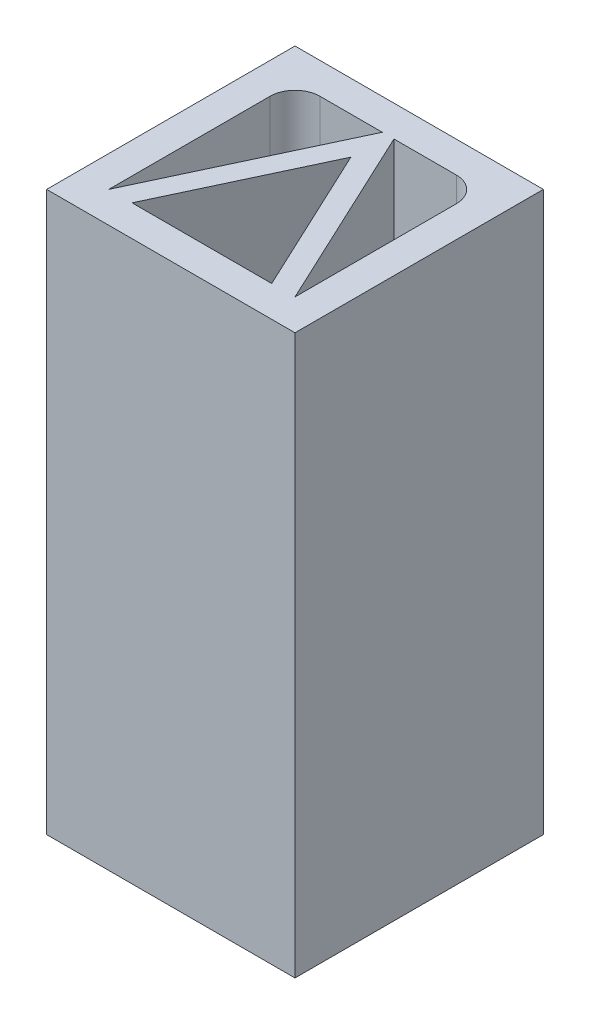
ISO-10303-21;
HEADER;
FILE_DESCRIPTION(('STEP AP214'),'2;1');
FILE_NAME('part.step','',(''),(''),'','','');
FILE_SCHEMA(('AUTOMOTIVE_DESIGN { 1 0 10303 214 1 1 1 1 }'));
ENDSEC;
DATA;
#1=APPLICATION_CONTEXT('core data for automotive mechanical design processes');
#2=APPLICATION_PROTOCOL_DEFINITION('international standard','automotive_design',2000,#1);
#3=PRODUCT_CONTEXT('',#1,'mechanical');
#4=PRODUCT('Part','Part','',(#3));
#5=PRODUCT_RELATED_PRODUCT_CATEGORY('part','',(#4));
#6=PRODUCT_DEFINITION_FORMATION('','',#4);
#7=PRODUCT_DEFINITION_CONTEXT('part definition',#1,'design');
#8=PRODUCT_DEFINITION('design','',#6,#7);
#9=PRODUCT_DEFINITION_SHAPE('','',#8);
#10=(LENGTH_UNIT() NAMED_UNIT(*) SI_UNIT(.MILLI.,.METRE.));
#11=(NAMED_UNIT(*) PLANE_ANGLE_UNIT() SI_UNIT($,.RADIAN.));
#12=(NAMED_UNIT(*) SI_UNIT($,.STERADIAN.) SOLID_ANGLE_UNIT());
#13=UNCERTAINTY_MEASURE_WITH_UNIT(LENGTH_MEASURE(1.E-05),#10,'distance_accuracy_value','');
#14=(GEOMETRIC_REPRESENTATION_CONTEXT(3) GLOBAL_UNCERTAINTY_ASSIGNED_CONTEXT((#13)) GLOBAL_UNIT_ASSIGNED_CONTEXT((#10,
#11,#12)) REPRESENTATION_CONTEXT('',''));
#15=CARTESIAN_POINT('',(0.,0.,0.));
#16=DIRECTION('',(0.,0.,1.));
#17=DIRECTION('',(1.,0.,0.));
#18=AXIS2_PLACEMENT_3D('',#15,#16,#17);
#19=CARTESIAN_POINT('',(2.5,45.,-17.5));
#20=DIRECTION('',(0.,0.,1.));
#21=DIRECTION('',(1.,0.,0.));
#22=AXIS2_PLACEMENT_3D('',#19,#20,#21);
#23=PLANE('',#22);
#24=DIRECTION('',(-1.,0.,0.));
#25=VECTOR('',#24,1.);
#26=CARTESIAN_POINT('',(2.5,0.,-17.5));
#27=LINE('',#26,#25);
#28=CARTESIAN_POINT('',(15.5,0.,-17.5));
#29=VERTEX_POINT('',#28);
#30=CARTESIAN_POINT('',(10.46875,0.,-17.5));
#31=VERTEX_POINT('',#30);
#32=EDGE_CURVE('E200',#29,#31,#27,.T.);
#33=ORIENTED_EDGE('',*,*,#32,.F.);
#34=DIRECTION('',(0.,-1.,0.));
#35=VECTOR('',#34,1.);
#36=CARTESIAN_POINT('',(15.5,45.,-17.5));
#37=LINE('',#36,#35);
#38=CARTESIAN_POINT('',(15.5,45.,-17.5));
#39=VERTEX_POINT('',#38);
#40=EDGE_CURVE('E55',#29,#39,#37,.F.);
#41=ORIENTED_EDGE('',*,*,#40,.T.);
#42=DIRECTION('',(-1.,0.,0.));
#43=VECTOR('',#42,1.);
#44=CARTESIAN_POINT('',(2.5,45.,-17.5));
#45=LINE('',#44,#43);
#46=CARTESIAN_POINT('',(10.46875,45.,-17.5));
#47=VERTEX_POINT('',#46);
#48=EDGE_CURVE('E208',#39,#47,#45,.T.);
#49=ORIENTED_EDGE('',*,*,#48,.T.);
#50=DIRECTION('',(0.,1.,0.));
#51=VECTOR('',#50,1.);
#52=CARTESIAN_POINT('',(10.46875,45.,-17.5));
#53=LINE('',#52,#51);
#54=EDGE_CURVE('E277',#31,#47,#53,.T.);
#55=ORIENTED_EDGE('',*,*,#54,.F.);
#56=EDGE_LOOP('',(#33,#41,#49,#55));
#57=FACE_BOUND('',#56,.T.);
#58=ADVANCED_FACE('F39',(#57),#23,.T.);
#59=CARTESIAN_POINT('',(0.,45.,0.));
#60=DIRECTION('',(0.,-1.,0.));
#61=DIRECTION('',(0.,0.,-1.));
#62=AXIS2_PLACEMENT_3D('',#59,#60,#61);
#63=PLANE('',#62);
#64=DIRECTION('',(0.424433876230719,0.,0.905458935958869));
#65=VECTOR('',#64,1.);
#66=CARTESIAN_POINT('',(17.5,45.,-2.5));
#67=LINE('',#66,#65);
#68=CARTESIAN_POINT('',(17.5,45.,-2.5));
#69=VERTEX_POINT('',#68);
#70=EDGE_CURVE('E181',#47,#69,#67,.T.);
#71=ORIENTED_EDGE('',*,*,#70,.F.);
#72=ORIENTED_EDGE('',*,*,#48,.F.);
#73=CARTESIAN_POINT('',(15.5,45.,-15.5));
#74=DIRECTION('',(0.,-1.,0.));
#75=DIRECTION('',(0.,0.,-1.));
#76=AXIS2_PLACEMENT_3D('',#73,#74,#75);
#77=CIRCLE('',#76,2.);
#78=CARTESIAN_POINT('',(17.5,45.,-15.5));
#79=VERTEX_POINT('',#78);
#80=EDGE_CURVE('E11',#39,#79,#77,.T.);
#81=ORIENTED_EDGE('',*,*,#80,.T.);
#82=DIRECTION('',(0.,0.,-1.));
#83=VECTOR('',#82,1.);
#84=CARTESIAN_POINT('',(17.5,45.,-17.5));
#85=LINE('',#84,#83);
#86=EDGE_CURVE('E203',#69,#79,#85,.T.);
#87=ORIENTED_EDGE('',*,*,#86,.F.);
#88=EDGE_LOOP('',(#71,#72,#81,#87));
#89=FACE_BOUND('',#88,.T.);
#90=DIRECTION('',(-0.424433876230719,0.,-0.905458935958869));
#91=VECTOR('',#90,1.);
#92=CARTESIAN_POINT('',(15.625,45.,-2.5));
#93=LINE('',#92,#91);
#94=CARTESIAN_POINT('',(15.625,45.,-2.5));
#95=VERTEX_POINT('',#94);
#96=CARTESIAN_POINT('',(10.,45.,-14.5));
#97=VERTEX_POINT('',#96);
#98=EDGE_CURVE('E164',#95,#97,#93,.T.);
#99=ORIENTED_EDGE('',*,*,#98,.F.);
#100=DIRECTION('',(1.,0.,0.));
#101=VECTOR('',#100,1.);
#102=CARTESIAN_POINT('',(2.5,45.,-2.5));
#103=LINE('',#102,#101);
#104=CARTESIAN_POINT('',(4.375,45.,-2.5));
#105=VERTEX_POINT('',#104);
#106=EDGE_CURVE('E165',#105,#95,#103,.T.);
#107=ORIENTED_EDGE('',*,*,#106,.F.);
#108=DIRECTION('',(-0.424433876230719,0.,0.905458935958869));
#109=VECTOR('',#108,1.);
#110=CARTESIAN_POINT('',(10.,45.,-14.5));
#111=LINE('',#110,#109);
#112=EDGE_CURVE('E148',#97,#105,#111,.T.);
#113=ORIENTED_EDGE('',*,*,#112,.F.);
#114=EDGE_LOOP('',(#99,#107,#113));
#115=FACE_BOUND('',#114,.T.);
#116=DIRECTION('',(0.,0.,1.));
#117=VECTOR('',#116,1.);
#118=CARTESIAN_POINT('',(0.,45.,0.));
#119=LINE('',#118,#117);
#120=CARTESIAN_POINT('',(0.,45.,-20.));
#121=VERTEX_POINT('',#120);
#122=CARTESIAN_POINT('',(0.,45.,0.));
#123=VERTEX_POINT('',#122);
#124=EDGE_CURVE('E232',#121,#123,#119,.T.);
#125=ORIENTED_EDGE('',*,*,#124,.T.);
#126=DIRECTION('',(1.,0.,0.));
#127=VECTOR('',#126,1.);
#128=CARTESIAN_POINT('',(0.,45.,0.));
#129=LINE('',#128,#127);
#130=CARTESIAN_POINT('',(20.,45.,0.));
#131=VERTEX_POINT('',#130);
#132=EDGE_CURVE('E236',#123,#131,#129,.T.);
#133=ORIENTED_EDGE('',*,*,#132,.T.);
#134=DIRECTION('',(0.,0.,-1.));
#135=VECTOR('',#134,1.);
#136=CARTESIAN_POINT('',(20.,45.,0.));
#137=LINE('',#136,#135);
#138=CARTESIAN_POINT('',(20.,45.,-20.));
#139=VERTEX_POINT('',#138);
#140=EDGE_CURVE('E240',#131,#139,#137,.T.);
#141=ORIENTED_EDGE('',*,*,#140,.T.);
#142=DIRECTION('',(-1.,0.,0.));
#143=VECTOR('',#142,1.);
#144=CARTESIAN_POINT('',(0.,45.,-20.));
#145=LINE('',#144,#143);
#146=EDGE_CURVE('E243',#139,#121,#145,.T.);
#147=ORIENTED_EDGE('',*,*,#146,.T.);
#148=EDGE_LOOP('',(#125,#133,#141,#147));
#149=FACE_BOUND('',#148,.T.);
#150=CARTESIAN_POINT('',(9.53125,45.,-17.5));
#151=VERTEX_POINT('',#150);
#152=CARTESIAN_POINT('',(4.5,45.,-17.5));
#153=VERTEX_POINT('',#152);
#154=EDGE_CURVE('E207',#151,#153,#45,.T.);
#155=ORIENTED_EDGE('',*,*,#154,.F.);
#156=DIRECTION('',(0.424433876230719,0.,-0.905458935958869));
#157=VECTOR('',#156,1.);
#158=CARTESIAN_POINT('',(10.,45.,-18.5));
#159=LINE('',#158,#157);
#160=CARTESIAN_POINT('',(2.5,45.,-2.5));
#161=VERTEX_POINT('',#160);
#162=EDGE_CURVE('E167',#161,#151,#159,.T.);
#163=ORIENTED_EDGE('',*,*,#162,.F.);
#164=DIRECTION('',(0.,0.,1.));
#165=VECTOR('',#164,1.);
#166=CARTESIAN_POINT('',(2.5,45.,-17.5));
#167=LINE('',#166,#165);
#168=CARTESIAN_POINT('',(2.5,45.,-15.5));
#169=VERTEX_POINT('',#168);
#170=EDGE_CURVE('E197',#169,#161,#167,.T.);
#171=ORIENTED_EDGE('',*,*,#170,.F.);
#172=CARTESIAN_POINT('',(4.5,45.,-15.5));
#173=DIRECTION('',(0.,-1.,0.));
#174=DIRECTION('',(0.,0.,-1.));
#175=AXIS2_PLACEMENT_3D('',#172,#173,#174);
#176=CIRCLE('',#175,2.);
#177=EDGE_CURVE('E297',#169,#153,#176,.T.);
#178=ORIENTED_EDGE('',*,*,#177,.T.);
#179=EDGE_LOOP('',(#155,#163,#171,#178));
#180=FACE_BOUND('',#179,.T.);
#181=ADVANCED_FACE('F162',(#89,#115,#149,#180),#63,.F.);
#182=CARTESIAN_POINT('',(0.,0.,0.));
#183=DIRECTION('',(0.,-1.,0.));
#184=DIRECTION('',(0.,0.,-1.));
#185=AXIS2_PLACEMENT_3D('',#182,#183,#184);
#186=PLANE('',#185);
#187=DIRECTION('',(0.,0.,-1.));
#188=VECTOR('',#187,1.);
#189=CARTESIAN_POINT('',(17.5,0.,-17.5));
#190=LINE('',#189,#188);
#191=CARTESIAN_POINT('',(17.5,0.,-2.5));
#192=VERTEX_POINT('',#191);
#193=CARTESIAN_POINT('',(17.5,0.,-15.5));
#194=VERTEX_POINT('',#193);
#195=EDGE_CURVE('E218',#192,#194,#190,.T.);
#196=ORIENTED_EDGE('',*,*,#195,.T.);
#197=CARTESIAN_POINT('',(15.5,0.,-15.5));
#198=DIRECTION('',(0.,-1.,0.));
#199=DIRECTION('',(0.,0.,-1.));
#200=AXIS2_PLACEMENT_3D('',#197,#198,#199);
#201=CIRCLE('',#200,2.);
#202=EDGE_CURVE('E48',#194,#29,#201,.F.);
#203=ORIENTED_EDGE('',*,*,#202,.T.);
#204=ORIENTED_EDGE('',*,*,#32,.T.);
#205=DIRECTION('',(0.424433876230719,0.,0.905458935958869));
#206=VECTOR('',#205,1.);
#207=CARTESIAN_POINT('',(17.5,0.,-2.5));
#208=LINE('',#207,#206);
#209=EDGE_CURVE('E172',#31,#192,#208,.T.);
#210=ORIENTED_EDGE('',*,*,#209,.T.);
#211=EDGE_LOOP('',(#196,#203,#204,#210));
#212=FACE_BOUND('',#211,.T.);
#213=DIRECTION('',(1.,0.,0.));
#214=VECTOR('',#213,1.);
#215=CARTESIAN_POINT('',(2.5,0.,-2.5));
#216=LINE('',#215,#214);
#217=CARTESIAN_POINT('',(4.375,0.,-2.5));
#218=VERTEX_POINT('',#217);
#219=CARTESIAN_POINT('',(15.625,0.,-2.5));
#220=VERTEX_POINT('',#219);
#221=EDGE_CURVE('E214',#218,#220,#216,.T.);
#222=ORIENTED_EDGE('',*,*,#221,.T.);
#223=DIRECTION('',(-0.424433876230719,0.,-0.905458935958869));
#224=VECTOR('',#223,1.);
#225=CARTESIAN_POINT('',(15.625,0.,-2.5));
#226=LINE('',#225,#224);
#227=CARTESIAN_POINT('',(10.,0.,-14.5));
#228=VERTEX_POINT('',#227);
#229=EDGE_CURVE('E185',#220,#228,#226,.T.);
#230=ORIENTED_EDGE('',*,*,#229,.T.);
#231=DIRECTION('',(-0.424433876230719,0.,0.905458935958869));
#232=VECTOR('',#231,1.);
#233=CARTESIAN_POINT('',(10.,0.,-14.5));
#234=LINE('',#233,#232);
#235=EDGE_CURVE('E150',#228,#218,#234,.T.);
#236=ORIENTED_EDGE('',*,*,#235,.T.);
#237=EDGE_LOOP('',(#222,#230,#236));
#238=FACE_BOUND('',#237,.T.);
#239=DIRECTION('',(0.424433876230719,0.,-0.905458935958869));
#240=VECTOR('',#239,1.);
#241=CARTESIAN_POINT('',(10.,0.,-18.5));
#242=LINE('',#241,#240);
#243=CARTESIAN_POINT('',(2.5,0.,-2.5));
#244=VERTEX_POINT('',#243);
#245=CARTESIAN_POINT('',(9.53125,0.,-17.5));
#246=VERTEX_POINT('',#245);
#247=EDGE_CURVE('E176',#244,#246,#242,.T.);
#248=ORIENTED_EDGE('',*,*,#247,.T.);
#249=CARTESIAN_POINT('',(4.5,0.,-17.5));
#250=VERTEX_POINT('',#249);
#251=EDGE_CURVE('E221',#246,#250,#27,.T.);
#252=ORIENTED_EDGE('',*,*,#251,.T.);
#253=CARTESIAN_POINT('',(4.5,0.,-15.5));
#254=DIRECTION('',(0.,-1.,0.));
#255=DIRECTION('',(0.,0.,-1.));
#256=AXIS2_PLACEMENT_3D('',#253,#254,#255);
#257=CIRCLE('',#256,2.);
#258=CARTESIAN_POINT('',(2.5,0.,-15.5));
#259=VERTEX_POINT('',#258);
#260=EDGE_CURVE('E294',#250,#259,#257,.F.);
#261=ORIENTED_EDGE('',*,*,#260,.T.);
#262=DIRECTION('',(0.,0.,1.));
#263=VECTOR('',#262,1.);
#264=CARTESIAN_POINT('',(2.5,0.,-17.5));
#265=LINE('',#264,#263);
#266=EDGE_CURVE('E193',#259,#244,#265,.T.);
#267=ORIENTED_EDGE('',*,*,#266,.T.);
#268=EDGE_LOOP('',(#248,#252,#261,#267));
#269=FACE_BOUND('',#268,.T.);
#270=DIRECTION('',(0.,0.,1.));
#271=VECTOR('',#270,1.);
#272=CARTESIAN_POINT('',(0.,0.,0.));
#273=LINE('',#272,#271);
#274=CARTESIAN_POINT('',(0.,0.,-20.));
#275=VERTEX_POINT('',#274);
#276=CARTESIAN_POINT('',(0.,0.,0.));
#277=VERTEX_POINT('',#276);
#278=EDGE_CURVE('E231',#275,#277,#273,.T.);
#279=ORIENTED_EDGE('',*,*,#278,.F.);
#280=DIRECTION('',(-1.,0.,0.));
#281=VECTOR('',#280,1.);
#282=CARTESIAN_POINT('',(0.,0.,-20.));
#283=LINE('',#282,#281);
#284=CARTESIAN_POINT('',(20.,0.,-20.));
#285=VERTEX_POINT('',#284);
#286=EDGE_CURVE('E237',#285,#275,#283,.T.);
#287=ORIENTED_EDGE('',*,*,#286,.F.);
#288=DIRECTION('',(0.,0.,-1.));
#289=VECTOR('',#288,1.);
#290=CARTESIAN_POINT('',(20.,0.,0.));
#291=LINE('',#290,#289);
#292=CARTESIAN_POINT('',(20.,0.,0.));
#293=VERTEX_POINT('',#292);
#294=EDGE_CURVE('E253',#293,#285,#291,.T.);
#295=ORIENTED_EDGE('',*,*,#294,.F.);
#296=DIRECTION('',(1.,0.,0.));
#297=VECTOR('',#296,1.);
#298=CARTESIAN_POINT('',(0.,0.,0.));
#299=LINE('',#298,#297);
#300=EDGE_CURVE('E250',#277,#293,#299,.T.);
#301=ORIENTED_EDGE('',*,*,#300,.F.);
#302=EDGE_LOOP('',(#279,#287,#295,#301));
#303=FACE_BOUND('',#302,.T.);
#304=ADVANCED_FACE('F306',(#212,#238,#269,#303),#186,.T.);
#305=CARTESIAN_POINT('',(0.,45.,0.));
#306=DIRECTION('',(1.,0.,0.));
#307=DIRECTION('',(0.,0.,-1.));
#308=AXIS2_PLACEMENT_3D('',#305,#306,#307);
#309=PLANE('',#308);
#310=ORIENTED_EDGE('',*,*,#278,.T.);
#311=DIRECTION('',(0.,-1.,0.));
#312=VECTOR('',#311,1.);
#313=CARTESIAN_POINT('',(0.,45.,0.));
#314=LINE('',#313,#312);
#315=EDGE_CURVE('E269',#123,#277,#314,.T.);
#316=ORIENTED_EDGE('',*,*,#315,.F.);
#317=ORIENTED_EDGE('',*,*,#124,.F.);
#318=DIRECTION('',(0.,-1.,0.));
#319=VECTOR('',#318,1.);
#320=CARTESIAN_POINT('',(0.,45.,-20.));
#321=LINE('',#320,#319);
#322=EDGE_CURVE('E246',#121,#275,#321,.T.);
#323=ORIENTED_EDGE('',*,*,#322,.T.);
#324=EDGE_LOOP('',(#310,#316,#317,#323));
#325=FACE_BOUND('',#324,.T.);
#326=ADVANCED_FACE('F364',(#325),#309,.F.);
#327=CARTESIAN_POINT('',(0.,45.,0.));
#328=DIRECTION('',(0.,0.,-1.));
#329=DIRECTION('',(-1.,0.,0.));
#330=AXIS2_PLACEMENT_3D('',#327,#328,#329);
#331=PLANE('',#330);
#332=ORIENTED_EDGE('',*,*,#300,.T.);
#333=DIRECTION('',(0.,-1.,0.));
#334=VECTOR('',#333,1.);
#335=CARTESIAN_POINT('',(20.,45.,0.));
#336=LINE('',#335,#334);
#337=EDGE_CURVE('E265',#131,#293,#336,.T.);
#338=ORIENTED_EDGE('',*,*,#337,.F.);
#339=ORIENTED_EDGE('',*,*,#132,.F.);
#340=ORIENTED_EDGE('',*,*,#315,.T.);
#341=EDGE_LOOP('',(#332,#338,#339,#340));
#342=FACE_BOUND('',#341,.T.);
#343=ADVANCED_FACE('F371',(#342),#331,.F.);
#344=CARTESIAN_POINT('',(20.,45.,0.));
#345=DIRECTION('',(-1.,0.,0.));
#346=DIRECTION('',(0.,0.,1.));
#347=AXIS2_PLACEMENT_3D('',#344,#345,#346);
#348=PLANE('',#347);
#349=ORIENTED_EDGE('',*,*,#294,.T.);
#350=DIRECTION('',(0.,-1.,0.));
#351=VECTOR('',#350,1.);
#352=CARTESIAN_POINT('',(20.,45.,-20.));
#353=LINE('',#352,#351);
#354=EDGE_CURVE('E261',#139,#285,#353,.T.);
#355=ORIENTED_EDGE('',*,*,#354,.F.);
#356=ORIENTED_EDGE('',*,*,#140,.F.);
#357=ORIENTED_EDGE('',*,*,#337,.T.);
#358=EDGE_LOOP('',(#349,#355,#356,#357));
#359=FACE_BOUND('',#358,.T.);
#360=ADVANCED_FACE('F367',(#359),#348,.F.);
#361=CARTESIAN_POINT('',(0.,45.,-20.));
#362=DIRECTION('',(0.,0.,1.));
#363=DIRECTION('',(1.,0.,0.));
#364=AXIS2_PLACEMENT_3D('',#361,#362,#363);
#365=PLANE('',#364);
#366=ORIENTED_EDGE('',*,*,#286,.T.);
#367=ORIENTED_EDGE('',*,*,#322,.F.);
#368=ORIENTED_EDGE('',*,*,#146,.F.);
#369=ORIENTED_EDGE('',*,*,#354,.T.);
#370=EDGE_LOOP('',(#366,#367,#368,#369));
#371=FACE_BOUND('',#370,.T.);
#372=ADVANCED_FACE('F360',(#371),#365,.F.);
#373=CARTESIAN_POINT('',(2.5,45.,-17.5));
#374=DIRECTION('',(1.,0.,0.));
#375=DIRECTION('',(0.,0.,-1.));
#376=AXIS2_PLACEMENT_3D('',#373,#374,#375);
#377=PLANE('',#376);
#378=ORIENTED_EDGE('',*,*,#266,.F.);
#379=DIRECTION('',(0.,-1.,0.));
#380=VECTOR('',#379,1.);
#381=CARTESIAN_POINT('',(2.5,45.,-15.5));
#382=LINE('',#381,#380);
#383=EDGE_CURVE('E285',#259,#169,#382,.F.);
#384=ORIENTED_EDGE('',*,*,#383,.T.);
#385=ORIENTED_EDGE('',*,*,#170,.T.);
#386=DIRECTION('',(0.,-1.,0.));
#387=VECTOR('',#386,1.);
#388=CARTESIAN_POINT('',(2.5,45.,-2.5));
#389=LINE('',#388,#387);
#390=EDGE_CURVE('E227',#161,#244,#389,.T.);
#391=ORIENTED_EDGE('',*,*,#390,.T.);
#392=EDGE_LOOP('',(#378,#384,#385,#391));
#393=FACE_BOUND('',#392,.T.);
#394=ADVANCED_FACE('F321',(#393),#377,.T.);
#395=CARTESIAN_POINT('',(2.5,45.,-2.5));
#396=DIRECTION('',(0.,0.,-1.));
#397=DIRECTION('',(-1.,0.,0.));
#398=AXIS2_PLACEMENT_3D('',#395,#396,#397);
#399=PLANE('',#398);
#400=DIRECTION('',(0.,-1.,0.));
#401=VECTOR('',#400,1.);
#402=CARTESIAN_POINT('',(4.375,45.,-2.5));
#403=LINE('',#402,#401);
#404=EDGE_CURVE('E156',#105,#218,#403,.T.);
#405=ORIENTED_EDGE('',*,*,#404,.F.);
#406=ORIENTED_EDGE('',*,*,#106,.T.);
#407=DIRECTION('',(0.,-1.,0.));
#408=VECTOR('',#407,1.);
#409=CARTESIAN_POINT('',(15.625,45.,-2.5));
#410=LINE('',#409,#408);
#411=EDGE_CURVE('E157',#95,#220,#410,.T.);
#412=ORIENTED_EDGE('',*,*,#411,.T.);
#413=ORIENTED_EDGE('',*,*,#221,.F.);
#414=EDGE_LOOP('',(#405,#406,#412,#413));
#415=FACE_BOUND('',#414,.T.);
#416=ADVANCED_FACE('F351',(#415),#399,.T.);
#417=CARTESIAN_POINT('',(17.5,45.,-17.5));
#418=DIRECTION('',(-1.,0.,0.));
#419=DIRECTION('',(0.,0.,1.));
#420=AXIS2_PLACEMENT_3D('',#417,#418,#419);
#421=PLANE('',#420);
#422=ORIENTED_EDGE('',*,*,#86,.T.);
#423=DIRECTION('',(0.,-1.,0.));
#424=VECTOR('',#423,1.);
#425=CARTESIAN_POINT('',(17.5,0.,-15.5));
#426=LINE('',#425,#424);
#427=EDGE_CURVE('E288',#79,#194,#426,.T.);
#428=ORIENTED_EDGE('',*,*,#427,.T.);
#429=ORIENTED_EDGE('',*,*,#195,.F.);
#430=DIRECTION('',(0.,-1.,0.));
#431=VECTOR('',#430,1.);
#432=CARTESIAN_POINT('',(17.5,45.,-2.5));
#433=LINE('',#432,#431);
#434=EDGE_CURVE('E211',#69,#192,#433,.T.);
#435=ORIENTED_EDGE('',*,*,#434,.F.);
#436=EDGE_LOOP('',(#422,#428,#429,#435));
#437=FACE_BOUND('',#436,.T.);
#438=ADVANCED_FACE('F347',(#437),#421,.T.);
#439=ORIENTED_EDGE('',*,*,#154,.T.);
#440=DIRECTION('',(0.,-1.,0.));
#441=VECTOR('',#440,1.);
#442=CARTESIAN_POINT('',(4.5,0.,-17.5));
#443=LINE('',#442,#441);
#444=EDGE_CURVE('E281',#153,#250,#443,.T.);
#445=ORIENTED_EDGE('',*,*,#444,.T.);
#446=ORIENTED_EDGE('',*,*,#251,.F.);
#447=DIRECTION('',(0.,-1.,0.));
#448=VECTOR('',#447,1.);
#449=CARTESIAN_POINT('',(9.53125,45.,-17.5));
#450=LINE('',#449,#448);
#451=EDGE_CURVE('E273',#151,#246,#450,.T.);
#452=ORIENTED_EDGE('',*,*,#451,.F.);
#453=EDGE_LOOP('',(#439,#445,#446,#452));
#454=FACE_BOUND('',#453,.T.);
#455=ADVANCED_FACE('F312',(#454),#23,.T.);
#456=CARTESIAN_POINT('',(17.5,45.,-2.5));
#457=DIRECTION('',(0.905458935958868,0.,-0.424433876230719));
#458=DIRECTION('',(-0.424433876230719,0.,-0.905458935958869));
#459=AXIS2_PLACEMENT_3D('',#456,#457,#458);
#460=PLANE('',#459);
#461=ORIENTED_EDGE('',*,*,#209,.F.);
#462=ORIENTED_EDGE('',*,*,#54,.T.);
#463=ORIENTED_EDGE('',*,*,#70,.T.);
#464=ORIENTED_EDGE('',*,*,#434,.T.);
#465=EDGE_LOOP('',(#461,#462,#463,#464));
#466=FACE_BOUND('',#465,.T.);
#467=ADVANCED_FACE('F328',(#466),#460,.T.);
#468=CARTESIAN_POINT('',(10.,45.,-18.5));
#469=DIRECTION('',(-0.905458935958868,0.,-0.424433876230719));
#470=DIRECTION('',(-0.424433876230719,0.,0.905458935958869));
#471=AXIS2_PLACEMENT_3D('',#468,#469,#470);
#472=PLANE('',#471);
#473=ORIENTED_EDGE('',*,*,#162,.T.);
#474=ORIENTED_EDGE('',*,*,#451,.T.);
#475=ORIENTED_EDGE('',*,*,#247,.F.);
#476=ORIENTED_EDGE('',*,*,#390,.F.);
#477=EDGE_LOOP('',(#473,#474,#475,#476));
#478=FACE_BOUND('',#477,.T.);
#479=ADVANCED_FACE('F326',(#478),#472,.T.);
#480=CARTESIAN_POINT('',(10.,45.,-14.5));
#481=DIRECTION('',(0.905458935958868,0.,0.424433876230719));
#482=DIRECTION('',(0.424433876230719,0.,-0.905458935958869));
#483=AXIS2_PLACEMENT_3D('',#480,#481,#482);
#484=PLANE('',#483);
#485=ORIENTED_EDGE('',*,*,#235,.F.);
#486=DIRECTION('',(0.,-1.,0.));
#487=VECTOR('',#486,1.);
#488=CARTESIAN_POINT('',(10.,45.,-14.5));
#489=LINE('',#488,#487);
#490=EDGE_CURVE('E144',#97,#228,#489,.T.);
#491=ORIENTED_EDGE('',*,*,#490,.F.);
#492=ORIENTED_EDGE('',*,*,#112,.T.);
#493=ORIENTED_EDGE('',*,*,#404,.T.);
#494=EDGE_LOOP('',(#485,#491,#492,#493));
#495=FACE_BOUND('',#494,.T.);
#496=ADVANCED_FACE('F146',(#495),#484,.T.);
#497=CARTESIAN_POINT('',(15.625,45.,-2.5));
#498=DIRECTION('',(-0.905458935958868,0.,0.424433876230719));
#499=DIRECTION('',(0.424433876230719,0.,0.905458935958869));
#500=AXIS2_PLACEMENT_3D('',#497,#498,#499);
#501=PLANE('',#500);
#502=ORIENTED_EDGE('',*,*,#229,.F.);
#503=ORIENTED_EDGE('',*,*,#411,.F.);
#504=ORIENTED_EDGE('',*,*,#98,.T.);
#505=ORIENTED_EDGE('',*,*,#490,.T.);
#506=EDGE_LOOP('',(#502,#503,#504,#505));
#507=FACE_BOUND('',#506,.T.);
#508=ADVANCED_FACE('F170',(#507),#501,.T.);
#509=CARTESIAN_POINT('',(4.5,45.,-15.5));
#510=DIRECTION('',(0.,1.,0.));
#511=DIRECTION('',(0.,0.,1.));
#512=AXIS2_PLACEMENT_3D('',#509,#510,#511);
#513=CYLINDRICAL_SURFACE('',#512,2.);
#514=ORIENTED_EDGE('',*,*,#177,.F.);
#515=ORIENTED_EDGE('',*,*,#383,.F.);
#516=ORIENTED_EDGE('',*,*,#260,.F.);
#517=ORIENTED_EDGE('',*,*,#444,.F.);
#518=EDGE_LOOP('',(#514,#515,#516,#517));
#519=FACE_BOUND('',#518,.T.);
#520=ADVANCED_FACE('F317',(#519),#513,.F.);
#521=CARTESIAN_POINT('',(15.5,45.,-15.5));
#522=DIRECTION('',(0.,1.,0.));
#523=DIRECTION('',(0.,0.,1.));
#524=AXIS2_PLACEMENT_3D('',#521,#522,#523);
#525=CYLINDRICAL_SURFACE('',#524,2.);
#526=ORIENTED_EDGE('',*,*,#80,.F.);
#527=ORIENTED_EDGE('',*,*,#40,.F.);
#528=ORIENTED_EDGE('',*,*,#202,.F.);
#529=ORIENTED_EDGE('',*,*,#427,.F.);
#530=EDGE_LOOP('',(#526,#527,#528,#529));
#531=FACE_BOUND('',#530,.T.);
#532=ADVANCED_FACE('F41',(#531),#525,.F.);
#533=CLOSED_SHELL('',(#58,#181,#304,#326,#343,#360,#372,#394,#416,#438,#455,#467,#479,#496,#508,
#520,#532));
#534=MANIFOLD_SOLID_BREP('B2',#533);
#535=ADVANCED_BREP_SHAPE_REPRESENTATION('',(#18,#534),#14);
#536=SHAPE_DEFINITION_REPRESENTATION(#9,#535);
ENDSEC;
END-ISO-10303-21;
